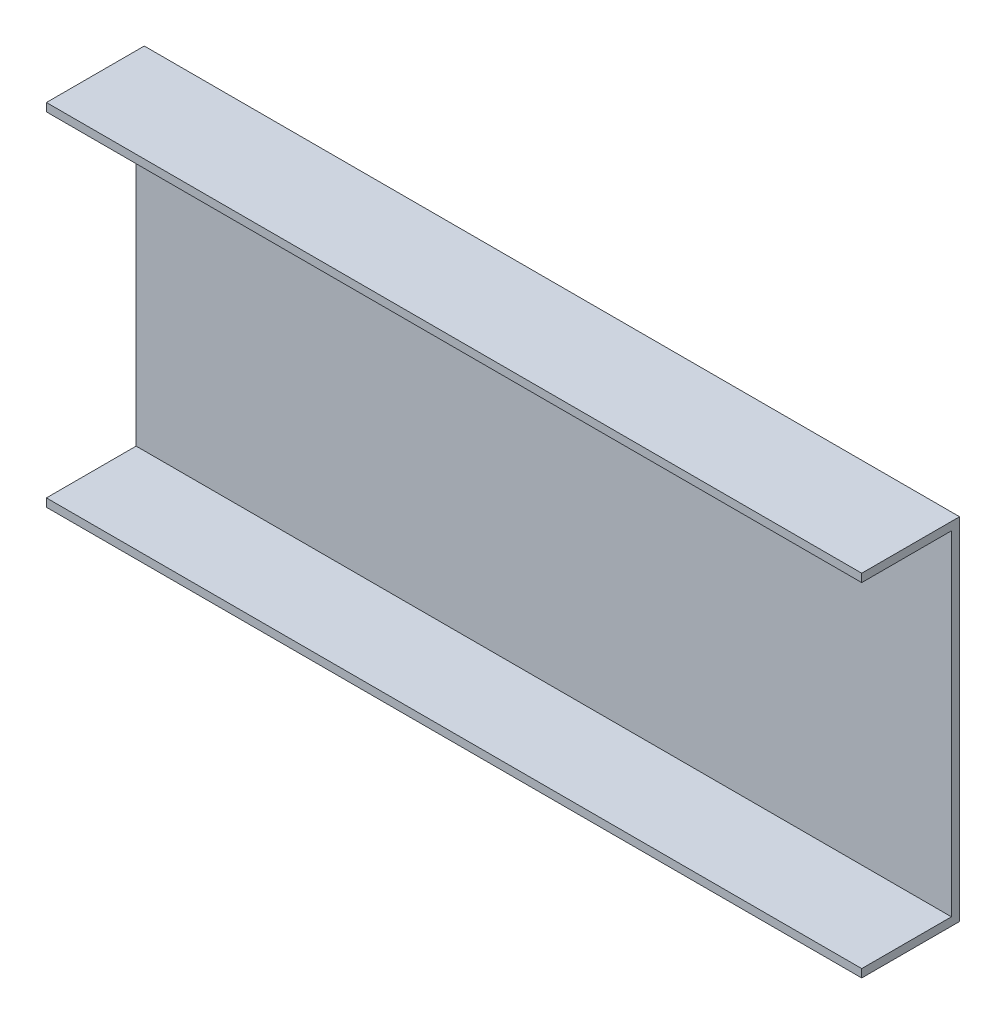
ISO-10303-21;
HEADER;
FILE_DESCRIPTION(('STEP AP214'),'2;1');
FILE_NAME('part.step','',(''),(''),'','','');
FILE_SCHEMA(('AUTOMOTIVE_DESIGN { 1 0 10303 214 1 1 1 1 }'));
ENDSEC;
DATA;
#1=APPLICATION_CONTEXT('core data for automotive mechanical design processes');
#2=APPLICATION_PROTOCOL_DEFINITION('international standard','automotive_design',2000,#1);
#3=PRODUCT_CONTEXT('',#1,'mechanical');
#4=PRODUCT('Part','Part','',(#3));
#5=PRODUCT_RELATED_PRODUCT_CATEGORY('part','',(#4));
#6=PRODUCT_DEFINITION_FORMATION('','',#4);
#7=PRODUCT_DEFINITION_CONTEXT('part definition',#1,'design');
#8=PRODUCT_DEFINITION('design','',#6,#7);
#9=PRODUCT_DEFINITION_SHAPE('','',#8);
#10=(LENGTH_UNIT() NAMED_UNIT(*) SI_UNIT(.MILLI.,.METRE.));
#11=(NAMED_UNIT(*) PLANE_ANGLE_UNIT() SI_UNIT($,.RADIAN.));
#12=(NAMED_UNIT(*) SI_UNIT($,.STERADIAN.) SOLID_ANGLE_UNIT());
#13=UNCERTAINTY_MEASURE_WITH_UNIT(LENGTH_MEASURE(1.E-05),#10,'distance_accuracy_value','');
#14=(GEOMETRIC_REPRESENTATION_CONTEXT(3) GLOBAL_UNCERTAINTY_ASSIGNED_CONTEXT((#13)) GLOBAL_UNIT_ASSIGNED_CONTEXT((#10,
#11,#12)) REPRESENTATION_CONTEXT('',''));
#15=CARTESIAN_POINT('',(0.,0.,0.));
#16=DIRECTION('',(0.,0.,1.));
#17=DIRECTION('',(1.,0.,0.));
#18=AXIS2_PLACEMENT_3D('',#15,#16,#17);
#19=CARTESIAN_POINT('',(0.,0.,12.));
#20=DIRECTION('',(0.,0.,1.));
#21=DIRECTION('',(1.,0.,0.));
#22=AXIS2_PLACEMENT_3D('',#19,#20,#21);
#23=PLANE('',#22);
#24=DIRECTION('',(-1.,0.,0.));
#25=VECTOR('',#24,1.);
#26=CARTESIAN_POINT('',(0.,-1.,12.));
#27=LINE('',#26,#25);
#28=CARTESIAN_POINT('',(100.,-1.,12.));
#29=VERTEX_POINT('',#28);
#30=CARTESIAN_POINT('',(0.,-1.,12.));
#31=VERTEX_POINT('',#30);
#32=EDGE_CURVE('E136',#29,#31,#27,.T.);
#33=ORIENTED_EDGE('',*,*,#32,.F.);
#34=DIRECTION('',(0.,1.,0.));
#35=VECTOR('',#34,1.);
#36=CARTESIAN_POINT('',(100.,0.,12.));
#37=LINE('',#36,#35);
#38=CARTESIAN_POINT('',(100.,0.,12.));
#39=VERTEX_POINT('',#38);
#40=EDGE_CURVE('E157',#29,#39,#37,.T.);
#41=ORIENTED_EDGE('',*,*,#40,.T.);
#42=DIRECTION('',(-1.,0.,0.));
#43=VECTOR('',#42,1.);
#44=CARTESIAN_POINT('',(0.,0.,12.));
#45=LINE('',#44,#43);
#46=CARTESIAN_POINT('',(0.,0.,12.));
#47=VERTEX_POINT('',#46);
#48=EDGE_CURVE('E68',#39,#47,#45,.T.);
#49=ORIENTED_EDGE('',*,*,#48,.T.);
#50=DIRECTION('',(0.,-1.,0.));
#51=VECTOR('',#50,1.);
#52=CARTESIAN_POINT('',(0.,0.,12.));
#53=LINE('',#52,#51);
#54=EDGE_CURVE('E151',#47,#31,#53,.T.);
#55=ORIENTED_EDGE('',*,*,#54,.T.);
#56=EDGE_LOOP('',(#33,#41,#49,#55));
#57=FACE_BOUND('',#56,.T.);
#58=ADVANCED_FACE('F43',(#57),#23,.T.);
#59=CARTESIAN_POINT('',(0.,0.,12.));
#60=DIRECTION('',(1.,0.,0.));
#61=DIRECTION('',(0.,1.,0.));
#62=AXIS2_PLACEMENT_3D('',#59,#60,#61);
#63=PLANE('',#62);
#64=DIRECTION('',(0.,-1.,0.));
#65=VECTOR('',#64,1.);
#66=CARTESIAN_POINT('',(0.,-1.,1.));
#67=LINE('',#66,#65);
#68=CARTESIAN_POINT('',(0.,-1.,1.));
#69=VERTEX_POINT('',#68);
#70=CARTESIAN_POINT('',(0.,-42.,1.));
#71=VERTEX_POINT('',#70);
#72=EDGE_CURVE('E126',#69,#71,#67,.T.);
#73=ORIENTED_EDGE('',*,*,#72,.F.);
#74=DIRECTION('',(0.,0.,1.));
#75=VECTOR('',#74,1.);
#76=CARTESIAN_POINT('',(0.,-1.,1.));
#77=LINE('',#76,#75);
#78=EDGE_CURVE('E170',#69,#31,#77,.T.);
#79=ORIENTED_EDGE('',*,*,#78,.T.);
#80=ORIENTED_EDGE('',*,*,#54,.F.);
#81=DIRECTION('',(0.,0.,-1.));
#82=VECTOR('',#81,1.);
#83=CARTESIAN_POINT('',(0.,0.,12.));
#84=LINE('',#83,#82);
#85=CARTESIAN_POINT('',(0.,0.,0.));
#86=VERTEX_POINT('',#85);
#87=EDGE_CURVE('E164',#47,#86,#84,.T.);
#88=ORIENTED_EDGE('',*,*,#87,.T.);
#89=DIRECTION('',(0.,-1.,0.));
#90=VECTOR('',#89,1.);
#91=CARTESIAN_POINT('',(0.,0.,0.));
#92=LINE('',#91,#90);
#93=CARTESIAN_POINT('',(0.,-43.,0.));
#94=VERTEX_POINT('',#93);
#95=EDGE_CURVE('E165',#86,#94,#92,.T.);
#96=ORIENTED_EDGE('',*,*,#95,.T.);
#97=DIRECTION('',(0.,0.,-1.));
#98=VECTOR('',#97,1.);
#99=CARTESIAN_POINT('',(0.,-43.,12.));
#100=LINE('',#99,#98);
#101=CARTESIAN_POINT('',(0.,-43.,12.));
#102=VERTEX_POINT('',#101);
#103=EDGE_CURVE('E11',#102,#94,#100,.T.);
#104=ORIENTED_EDGE('',*,*,#103,.F.);
#105=CARTESIAN_POINT('',(0.,-42.,12.));
#106=VERTEX_POINT('',#105);
#107=EDGE_CURVE('E96',#106,#102,#53,.T.);
#108=ORIENTED_EDGE('',*,*,#107,.F.);
#109=DIRECTION('',(0.,0.,1.));
#110=VECTOR('',#109,1.);
#111=CARTESIAN_POINT('',(0.,-42.,1.));
#112=LINE('',#111,#110);
#113=EDGE_CURVE('E59',#71,#106,#112,.T.);
#114=ORIENTED_EDGE('',*,*,#113,.F.);
#115=EDGE_LOOP('',(#73,#79,#80,#88,#96,#104,#108,#114));
#116=FACE_BOUND('',#115,.T.);
#117=ADVANCED_FACE('F45',(#116),#63,.F.);
#118=CARTESIAN_POINT('',(0.,-43.,12.));
#119=DIRECTION('',(0.,1.,0.));
#120=DIRECTION('',(0.,0.,1.));
#121=AXIS2_PLACEMENT_3D('',#118,#119,#120);
#122=PLANE('',#121);
#123=DIRECTION('',(1.,0.,0.));
#124=VECTOR('',#123,1.);
#125=CARTESIAN_POINT('',(0.,-43.,0.));
#126=LINE('',#125,#124);
#127=CARTESIAN_POINT('',(100.,-43.,0.));
#128=VERTEX_POINT('',#127);
#129=EDGE_CURVE('E169',#94,#128,#126,.T.);
#130=ORIENTED_EDGE('',*,*,#129,.T.);
#131=DIRECTION('',(0.,0.,-1.));
#132=VECTOR('',#131,1.);
#133=CARTESIAN_POINT('',(100.,-43.,12.));
#134=LINE('',#133,#132);
#135=CARTESIAN_POINT('',(100.,-43.,12.));
#136=VERTEX_POINT('',#135);
#137=EDGE_CURVE('E52',#136,#128,#134,.T.);
#138=ORIENTED_EDGE('',*,*,#137,.F.);
#139=DIRECTION('',(1.,0.,0.));
#140=VECTOR('',#139,1.);
#141=CARTESIAN_POINT('',(0.,-43.,12.));
#142=LINE('',#141,#140);
#143=EDGE_CURVE('E154',#102,#136,#142,.T.);
#144=ORIENTED_EDGE('',*,*,#143,.F.);
#145=ORIENTED_EDGE('',*,*,#103,.T.);
#146=EDGE_LOOP('',(#130,#138,#144,#145));
#147=FACE_BOUND('',#146,.T.);
#148=ADVANCED_FACE('F237',(#147),#122,.F.);
#149=CARTESIAN_POINT('',(100.,0.,12.));
#150=DIRECTION('',(-1.,0.,0.));
#151=DIRECTION('',(0.,0.,1.));
#152=AXIS2_PLACEMENT_3D('',#149,#150,#151);
#153=PLANE('',#152);
#154=ORIENTED_EDGE('',*,*,#40,.F.);
#155=DIRECTION('',(0.,0.,1.));
#156=VECTOR('',#155,1.);
#157=CARTESIAN_POINT('',(100.,-1.,1.));
#158=LINE('',#157,#156);
#159=CARTESIAN_POINT('',(100.,-1.,1.));
#160=VERTEX_POINT('',#159);
#161=EDGE_CURVE('E145',#160,#29,#158,.T.);
#162=ORIENTED_EDGE('',*,*,#161,.F.);
#163=DIRECTION('',(0.,1.,0.));
#164=VECTOR('',#163,1.);
#165=CARTESIAN_POINT('',(100.,-1.,1.));
#166=LINE('',#165,#164);
#167=CARTESIAN_POINT('',(100.,-42.,1.));
#168=VERTEX_POINT('',#167);
#169=EDGE_CURVE('E125',#168,#160,#166,.T.);
#170=ORIENTED_EDGE('',*,*,#169,.F.);
#171=DIRECTION('',(0.,0.,1.));
#172=VECTOR('',#171,1.);
#173=CARTESIAN_POINT('',(100.,-42.,1.));
#174=LINE('',#173,#172);
#175=CARTESIAN_POINT('',(100.,-42.,12.));
#176=VERTEX_POINT('',#175);
#177=EDGE_CURVE('E121',#168,#176,#174,.T.);
#178=ORIENTED_EDGE('',*,*,#177,.T.);
#179=EDGE_CURVE('E158',#136,#176,#37,.T.);
#180=ORIENTED_EDGE('',*,*,#179,.F.);
#181=ORIENTED_EDGE('',*,*,#137,.T.);
#182=DIRECTION('',(0.,1.,0.));
#183=VECTOR('',#182,1.);
#184=CARTESIAN_POINT('',(100.,0.,0.));
#185=LINE('',#184,#183);
#186=CARTESIAN_POINT('',(100.,0.,0.));
#187=VERTEX_POINT('',#186);
#188=EDGE_CURVE('E172',#128,#187,#185,.T.);
#189=ORIENTED_EDGE('',*,*,#188,.T.);
#190=DIRECTION('',(0.,0.,-1.));
#191=VECTOR('',#190,1.);
#192=CARTESIAN_POINT('',(100.,0.,12.));
#193=LINE('',#192,#191);
#194=EDGE_CURVE('E178',#39,#187,#193,.T.);
#195=ORIENTED_EDGE('',*,*,#194,.F.);
#196=EDGE_LOOP('',(#154,#162,#170,#178,#180,#181,#189,#195));
#197=FACE_BOUND('',#196,.T.);
#198=ADVANCED_FACE('F189',(#197),#153,.F.);
#199=CARTESIAN_POINT('',(0.,0.,12.));
#200=DIRECTION('',(0.,-1.,0.));
#201=DIRECTION('',(0.,0.,-1.));
#202=AXIS2_PLACEMENT_3D('',#199,#200,#201);
#203=PLANE('',#202);
#204=DIRECTION('',(-1.,0.,0.));
#205=VECTOR('',#204,1.);
#206=CARTESIAN_POINT('',(0.,0.,0.));
#207=LINE('',#206,#205);
#208=EDGE_CURVE('E89',#187,#86,#207,.T.);
#209=ORIENTED_EDGE('',*,*,#208,.T.);
#210=ORIENTED_EDGE('',*,*,#87,.F.);
#211=ORIENTED_EDGE('',*,*,#48,.F.);
#212=ORIENTED_EDGE('',*,*,#194,.T.);
#213=EDGE_LOOP('',(#209,#210,#211,#212));
#214=FACE_BOUND('',#213,.T.);
#215=ADVANCED_FACE('F196',(#214),#203,.F.);
#216=DIRECTION('',(1.,0.,0.));
#217=VECTOR('',#216,1.);
#218=CARTESIAN_POINT('',(0.,-42.,12.));
#219=LINE('',#218,#217);
#220=EDGE_CURVE('E226',#106,#176,#219,.T.);
#221=ORIENTED_EDGE('',*,*,#220,.F.);
#222=ORIENTED_EDGE('',*,*,#107,.T.);
#223=ORIENTED_EDGE('',*,*,#143,.T.);
#224=ORIENTED_EDGE('',*,*,#179,.T.);
#225=EDGE_LOOP('',(#221,#222,#223,#224));
#226=FACE_BOUND('',#225,.T.);
#227=ADVANCED_FACE('F233',(#226),#23,.T.);
#228=CARTESIAN_POINT('',(0.,0.,0.));
#229=DIRECTION('',(0.,0.,1.));
#230=DIRECTION('',(1.,0.,0.));
#231=AXIS2_PLACEMENT_3D('',#228,#229,#230);
#232=PLANE('',#231);
#233=ORIENTED_EDGE('',*,*,#95,.F.);
#234=ORIENTED_EDGE('',*,*,#208,.F.);
#235=ORIENTED_EDGE('',*,*,#188,.F.);
#236=ORIENTED_EDGE('',*,*,#129,.F.);
#237=EDGE_LOOP('',(#233,#234,#235,#236));
#238=FACE_BOUND('',#237,.T.);
#239=ADVANCED_FACE('F194',(#238),#232,.F.);
#240=CARTESIAN_POINT('',(0.,-1.,1.));
#241=DIRECTION('',(0.,1.,0.));
#242=DIRECTION('',(0.,0.,1.));
#243=AXIS2_PLACEMENT_3D('',#240,#241,#242);
#244=PLANE('',#243);
#245=ORIENTED_EDGE('',*,*,#32,.T.);
#246=ORIENTED_EDGE('',*,*,#78,.F.);
#247=DIRECTION('',(-1.,0.,0.));
#248=VECTOR('',#247,1.);
#249=CARTESIAN_POINT('',(0.,-1.,1.));
#250=LINE('',#249,#248);
#251=EDGE_CURVE('E132',#160,#69,#250,.T.);
#252=ORIENTED_EDGE('',*,*,#251,.F.);
#253=ORIENTED_EDGE('',*,*,#161,.T.);
#254=EDGE_LOOP('',(#245,#246,#252,#253));
#255=FACE_BOUND('',#254,.T.);
#256=ADVANCED_FACE('F230',(#255),#244,.F.);
#257=CARTESIAN_POINT('',(0.,-42.,1.));
#258=DIRECTION('',(0.,-1.,0.));
#259=DIRECTION('',(0.,0.,-1.));
#260=AXIS2_PLACEMENT_3D('',#257,#258,#259);
#261=PLANE('',#260);
#262=ORIENTED_EDGE('',*,*,#220,.T.);
#263=ORIENTED_EDGE('',*,*,#177,.F.);
#264=DIRECTION('',(1.,0.,0.));
#265=VECTOR('',#264,1.);
#266=CARTESIAN_POINT('',(0.,-42.,1.));
#267=LINE('',#266,#265);
#268=EDGE_CURVE('E117',#71,#168,#267,.T.);
#269=ORIENTED_EDGE('',*,*,#268,.F.);
#270=ORIENTED_EDGE('',*,*,#113,.T.);
#271=EDGE_LOOP('',(#262,#263,#269,#270));
#272=FACE_BOUND('',#271,.T.);
#273=ADVANCED_FACE('F119',(#272),#261,.F.);
#274=CARTESIAN_POINT('',(0.,0.,1.));
#275=DIRECTION('',(0.,0.,1.));
#276=DIRECTION('',(1.,0.,0.));
#277=AXIS2_PLACEMENT_3D('',#274,#275,#276);
#278=PLANE('',#277);
#279=ORIENTED_EDGE('',*,*,#72,.T.);
#280=ORIENTED_EDGE('',*,*,#268,.T.);
#281=ORIENTED_EDGE('',*,*,#169,.T.);
#282=ORIENTED_EDGE('',*,*,#251,.T.);
#283=EDGE_LOOP('',(#279,#280,#281,#282));
#284=FACE_BOUND('',#283,.T.);
#285=ADVANCED_FACE('F130',(#284),#278,.T.);
#286=CLOSED_SHELL('',(#58,#117,#148,#198,#215,#227,#239,#256,#273,#285));
#287=MANIFOLD_SOLID_BREP('B2',#286);
#288=ADVANCED_BREP_SHAPE_REPRESENTATION('',(#18,#287),#14);
#289=SHAPE_DEFINITION_REPRESENTATION(#9,#288);
ENDSEC;
END-ISO-10303-21;
